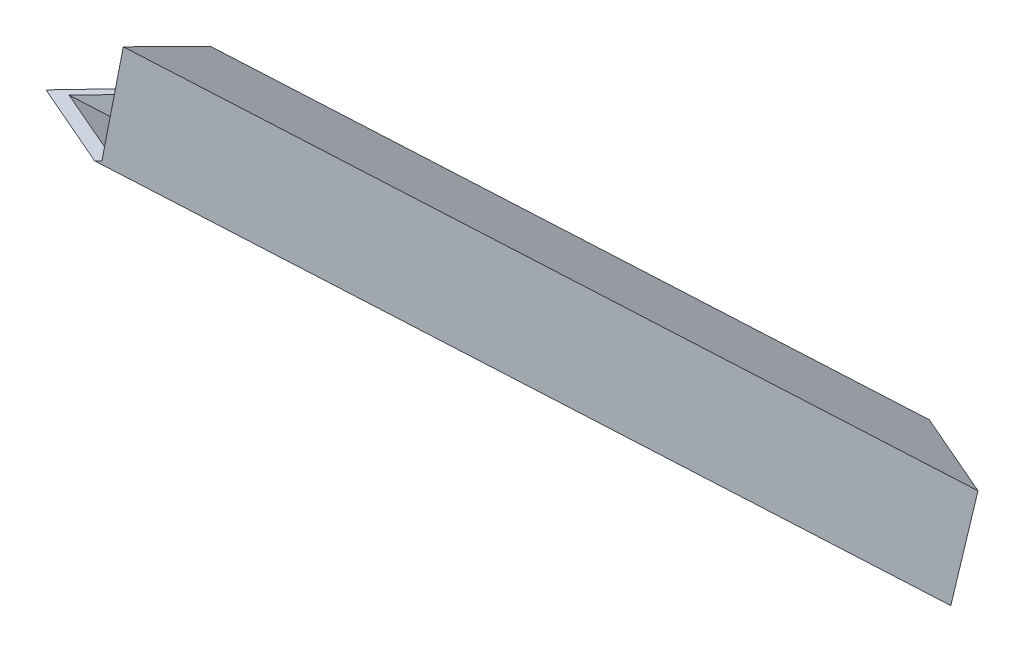
ISO-10303-21;
HEADER;
FILE_DESCRIPTION(('STEP AP214'),'2;1');
FILE_NAME('part.step','',(''),(''),'','','');
FILE_SCHEMA(('AUTOMOTIVE_DESIGN { 1 0 10303 214 1 1 1 1 }'));
ENDSEC;
DATA;
#1=APPLICATION_CONTEXT('core data for automotive mechanical design processes');
#2=APPLICATION_PROTOCOL_DEFINITION('international standard','automotive_design',2000,#1);
#3=PRODUCT_CONTEXT('',#1,'mechanical');
#4=PRODUCT('Part','Part','',(#3));
#5=PRODUCT_RELATED_PRODUCT_CATEGORY('part','',(#4));
#6=PRODUCT_DEFINITION_FORMATION('','',#4);
#7=PRODUCT_DEFINITION_CONTEXT('part definition',#1,'design');
#8=PRODUCT_DEFINITION('design','',#6,#7);
#9=PRODUCT_DEFINITION_SHAPE('','',#8);
#10=(LENGTH_UNIT() NAMED_UNIT(*) SI_UNIT(.MILLI.,.METRE.));
#11=(NAMED_UNIT(*) PLANE_ANGLE_UNIT() SI_UNIT($,.RADIAN.));
#12=(NAMED_UNIT(*) SI_UNIT($,.STERADIAN.) SOLID_ANGLE_UNIT());
#13=UNCERTAINTY_MEASURE_WITH_UNIT(LENGTH_MEASURE(1.E-05),#10,'distance_accuracy_value','');
#14=(GEOMETRIC_REPRESENTATION_CONTEXT(3) GLOBAL_UNCERTAINTY_ASSIGNED_CONTEXT((#13)) GLOBAL_UNIT_ASSIGNED_CONTEXT((#10,
#11,#12)) REPRESENTATION_CONTEXT('',''));
#15=CARTESIAN_POINT('',(0.,0.,0.));
#16=DIRECTION('',(0.,0.,1.));
#17=DIRECTION('',(1.,0.,0.));
#18=AXIS2_PLACEMENT_3D('',#15,#16,#17);
#19=CARTESIAN_POINT('',(-240.064673273436,-10.,-1701.13546591161));
#20=DIRECTION('',(-0.993532672656404,0.,0.113546591160732));
#21=DIRECTION('',(0.113546591160732,0.,0.993532672656404));
#22=AXIS2_PLACEMENT_3D('',#19,#20,#21);
#23=PLANE('',#22);
#24=DIRECTION('',(-0.0310586126136645,0.961862937380512,-0.271762860369564));
#25=VECTOR('',#24,1.);
#26=CARTESIAN_POINT('',(-158.679335720857,-7.72550361489224,-989.013762326542));
#27=LINE('',#26,#25);
#28=CARTESIAN_POINT('',(-158.605892094566,-10.,-988.371130596495));
#29=VERTEX_POINT('',#28);
#30=CARTESIAN_POINT('',(-159.247416918517,9.8675632824665,-993.984472806062));
#31=VERTEX_POINT('',#30);
#32=EDGE_CURVE('E139',#29,#31,#27,.T.);
#33=ORIENTED_EDGE('',*,*,#32,.T.);
#34=DIRECTION('',(-0.099495133200515,-0.481857838250816,-0.870582415504507));
#35=VECTOR('',#34,1.);
#36=CARTESIAN_POINT('',(-159.154464581572,10.3177341672098,-993.171139857796));
#37=LINE('',#36,#35);
#38=CARTESIAN_POINT('',(-161.870514932966,-2.83617707250504,-1016.9365804325));
#39=VERTEX_POINT('',#38);
#40=EDGE_CURVE('E141',#31,#39,#37,.T.);
#41=ORIENTED_EDGE('',*,*,#40,.T.);
#42=DIRECTION('',(0.0310586126136645,-0.961862937380512,0.271762860369564));
#43=VECTOR('',#42,1.);
#44=CARTESIAN_POINT('',(-161.48568752584,-14.7540056248329,-1013.56934062014));
#45=LINE('',#44,#43);
#46=CARTESIAN_POINT('',(-161.639194655938,-10.,-1014.9125280085));
#47=VERTEX_POINT('',#46);
#48=EDGE_CURVE('E180',#39,#47,#45,.T.);
#49=ORIENTED_EDGE('',*,*,#48,.T.);
#50=DIRECTION('',(0.113546591160732,0.,0.993532672656404));
#51=VECTOR('',#50,1.);
#52=CARTESIAN_POINT('',(-240.064673273436,-10.,-1701.13546591161));
#53=LINE('',#52,#51);
#54=CARTESIAN_POINT('',(-161.396530451028,-10.,-1012.78921621554));
#55=VERTEX_POINT('',#54);
#56=EDGE_CURVE('E176',#47,#55,#53,.T.);
#57=ORIENTED_EDGE('',*,*,#56,.T.);
#58=DIRECTION('',(0.0310586126136645,-0.961862937380512,0.271762860369564));
#59=VECTOR('',#58,1.);
#60=CARTESIAN_POINT('',(-161.307849638088,-12.7463811176913,-1012.01325910231));
#61=LINE('',#60,#59);
#62=CARTESIAN_POINT('',(-161.607753909707,-3.45856111039706,-1014.63742147898));
#63=VERTEX_POINT('',#62);
#64=EDGE_CURVE('E174',#63,#55,#61,.T.);
#65=ORIENTED_EDGE('',*,*,#64,.F.);
#66=DIRECTION('',(-0.099495133200515,-0.481857838250816,-0.870582415504507));
#67=VECTOR('',#66,1.);
#68=CARTESIAN_POINT('',(-159.184380698872,8.27790618287634,-993.432905884172));
#69=LINE('',#68,#67);
#70=CARTESIAN_POINT('',(-159.404351577569,7.2125807877791,-995.357651072772));
#71=VERTEX_POINT('',#70);
#72=EDGE_CURVE('E150',#71,#63,#69,.T.);
#73=ORIENTED_EDGE('',*,*,#72,.F.);
#74=DIRECTION('',(-0.0310586126136645,0.961862937380512,-0.271762860369564));
#75=VECTOR('',#74,1.);
#76=CARTESIAN_POINT('',(-158.950514121903,-6.84243942934128,-991.386573335689));
#77=LINE('',#76,#75);
#78=CARTESIAN_POINT('',(-158.848763165483,-9.99359350826317,-990.496252467016));
#79=VERTEX_POINT('',#78);
#80=EDGE_CURVE('E159',#79,#71,#77,.T.);
#81=ORIENTED_EDGE('',*,*,#80,.F.);
#82=DIRECTION('',(0.0994951332005149,0.481857838250817,0.870582415504506));
#83=VECTOR('',#82,1.);
#84=CARTESIAN_POINT('',(-158.230473125595,-6.99919677297728,-985.086214617996));
#85=LINE('',#84,#83);
#86=CARTESIAN_POINT('',(-158.850085992877,-10.,-990.507827206718));
#87=VERTEX_POINT('',#86);
#88=EDGE_CURVE('E138',#87,#79,#85,.T.);
#89=ORIENTED_EDGE('',*,*,#88,.F.);
#90=EDGE_CURVE('E169',#87,#29,#53,.T.);
#91=ORIENTED_EDGE('',*,*,#90,.T.);
#92=EDGE_LOOP('',(#33,#41,#49,#57,#65,#73,#81,#89,#91));
#93=FACE_BOUND('',#92,.T.);
#94=ADVANCED_FACE('F41',(#93),#23,.T.);
#95=CARTESIAN_POINT('',(-178.645390112232,-10.5725607534596,-996.808649348804));
#96=DIRECTION('',(0.708778209555371,0.212903658810695,0.672536602516548));
#97=DIRECTION('',(0.688317522845566,0.,-0.725409531053835));
#98=AXIS2_PLACEMENT_3D('',#95,#96,#97);
#99=PLANE('',#98);
#100=DIRECTION('',(0.,0.953369256848501,-0.301806328787413));
#101=VECTOR('',#100,1.);
#102=CARTESIAN_POINT('',(-69.9999999999999,-43.5179938494138,-1100.87924055687));
#103=LINE('',#102,#101);
#104=CARTESIAN_POINT('',(-69.9999999999999,-89.9999999999999,-1086.16451850116));
#105=VERTEX_POINT('',#104);
#106=CARTESIAN_POINT('',(-70.,-69.9999999999999,-1092.49588122593));
#107=VERTEX_POINT('',#106);
#108=EDGE_CURVE('E201',#105,#107,#103,.T.);
#109=ORIENTED_EDGE('',*,*,#108,.F.);
#110=DIRECTION('',(0.672536602516548,-0.491671667636119,-0.553130626090634));
#111=VECTOR('',#110,1.);
#112=CARTESIAN_POINT('',(-178.645390112232,-10.5725607534596,-996.808649348804));
#113=LINE('',#112,#111);
#114=CARTESIAN_POINT('',(-179.428571428571,-10.,-996.164518501162));
#115=VERTEX_POINT('',#114);
#116=EDGE_CURVE('E56',#115,#105,#113,.T.);
#117=ORIENTED_EDGE('',*,*,#116,.F.);
#118=DIRECTION('',(-0.688317522845566,0.,0.725409531053835));
#119=VECTOR('',#118,1.);
#120=CARTESIAN_POINT('',(-178.735892671024,-10.,-996.894524284839));
#121=LINE('',#120,#119);
#122=EDGE_CURVE('E168',#47,#115,#121,.T.);
#123=ORIENTED_EDGE('',*,*,#122,.F.);
#124=ORIENTED_EDGE('',*,*,#48,.F.);
#125=DIRECTION('',(0.672536602516548,-0.491671667636119,-0.553130626090634));
#126=VECTOR('',#125,1.);
#127=CARTESIAN_POINT('',(-174.387316936018,6.31448757724575,-1006.64208270153));
#128=LINE('',#127,#126);
#129=EDGE_CURVE('E158',#39,#107,#128,.T.);
#130=ORIENTED_EDGE('',*,*,#129,.T.);
#131=EDGE_LOOP('',(#109,#117,#123,#124,#130));
#132=FACE_BOUND('',#131,.T.);
#133=ADVANCED_FACE('F218',(#132),#99,.F.);
#134=CARTESIAN_POINT('',(-160.211752744911,10.5725607534596,-993.191350651195));
#135=DIRECTION('',(-0.212903658810694,-0.844352416535263,0.491671667636119));
#136=DIRECTION('',(0.,-0.503208632889708,-0.864164956351084));
#137=AXIS2_PLACEMENT_3D('',#134,#135,#136);
#138=PLANE('',#137);
#139=DIRECTION('',(0.917660497954147,0.,0.397365336302184));
#140=VECTOR('',#139,1.);
#141=CARTESIAN_POINT('',(-109.756341443655,-69.9999999999998,-1109.71117165536));
#142=LINE('',#141,#140);
#143=CARTESIAN_POINT('',(-50.0000000000001,-69.9999999999998,-1083.83548149884));
#144=VERTEX_POINT('',#143);
#145=EDGE_CURVE('E195',#107,#144,#142,.T.);
#146=ORIENTED_EDGE('',*,*,#145,.F.);
#147=ORIENTED_EDGE('',*,*,#129,.F.);
#148=ORIENTED_EDGE('',*,*,#40,.F.);
#149=DIRECTION('',(0.672536602516548,-0.491671667636119,-0.553130626090634));
#150=VECTOR('',#149,1.);
#151=CARTESIAN_POINT('',(-160.211752744911,10.5725607534596,-993.191350651195));
#152=LINE('',#151,#150);
#153=EDGE_CURVE('E155',#31,#144,#152,.T.);
#154=ORIENTED_EDGE('',*,*,#153,.T.);
#155=EDGE_LOOP('',(#146,#147,#148,#154));
#156=FACE_BOUND('',#155,.T.);
#157=ADVANCED_FACE('F209',(#156),#138,.F.);
#158=CARTESIAN_POINT('',(-164.469825921125,-6.31448757724561,-983.357917298473));
#159=DIRECTION('',(-0.708778209555371,-0.212903658810695,-0.672536602516548));
#160=DIRECTION('',(-0.688317522845566,0.,0.725409531053835));
#161=AXIS2_PLACEMENT_3D('',#158,#159,#160);
#162=PLANE('',#161);
#163=DIRECTION('',(0.,-0.953369256848501,0.301806328787413));
#164=VECTOR('',#163,1.);
#165=CARTESIAN_POINT('',(-49.9999999999999,-41.0261121339266,-1093.00769118018));
#166=LINE('',#165,#164);
#167=CARTESIAN_POINT('',(-49.9999999999999,-89.9999999999999,-1077.50411877407));
#168=VERTEX_POINT('',#167);
#169=EDGE_CURVE('E191',#144,#168,#166,.T.);
#170=ORIENTED_EDGE('',*,*,#169,.F.);
#171=ORIENTED_EDGE('',*,*,#153,.F.);
#172=ORIENTED_EDGE('',*,*,#32,.F.);
#173=DIRECTION('',(0.688317522845566,0.,-0.725409531053835));
#174=VECTOR('',#173,1.);
#175=CARTESIAN_POINT('',(-163.887270615505,-10.,-982.805149506323));
#176=LINE('',#175,#174);
#177=CARTESIAN_POINT('',(-159.428571428571,-10.,-987.504118774071));
#178=VERTEX_POINT('',#177);
#179=EDGE_CURVE('E166',#178,#29,#176,.T.);
#180=ORIENTED_EDGE('',*,*,#179,.F.);
#181=DIRECTION('',(0.672536602516548,-0.491671667636119,-0.553130626090634));
#182=VECTOR('',#181,1.);
#183=CARTESIAN_POINT('',(-164.469825921125,-6.31448757724561,-983.357917298473));
#184=LINE('',#183,#182);
#185=EDGE_CURVE('E152',#178,#168,#184,.T.);
#186=ORIENTED_EDGE('',*,*,#185,.T.);
#187=EDGE_LOOP('',(#170,#171,#172,#180,#186));
#188=FACE_BOUND('',#187,.T.);
#189=ADVANCED_FACE('F213',(#188),#162,.F.);
#190=CARTESIAN_POINT('',(-164.469825921125,-6.31448757724561,-983.357917298473));
#191=DIRECTION('',(0.212903658810694,0.844352416535263,-0.491671667636119));
#192=DIRECTION('',(0.,0.503208632889708,0.864164956351084));
#193=AXIS2_PLACEMENT_3D('',#190,#191,#192);
#194=PLANE('',#193);
#195=DIRECTION('',(-0.917660497954147,0.,-0.397365336302184));
#196=VECTOR('',#195,1.);
#197=CARTESIAN_POINT('',(-112.065050526604,-89.9999999999999,-1104.37952610619));
#198=LINE('',#197,#196);
#199=EDGE_CURVE('E187',#168,#105,#198,.T.);
#200=ORIENTED_EDGE('',*,*,#199,.F.);
#201=ORIENTED_EDGE('',*,*,#185,.F.);
#202=DIRECTION('',(0.917660497954147,0.,0.397365336302183));
#203=VECTOR('',#202,1.);
#204=CARTESIAN_POINT('',(-162.161918074991,-10.,-988.687712501606));
#205=LINE('',#204,#203);
#206=EDGE_CURVE('E49',#115,#178,#205,.T.);
#207=ORIENTED_EDGE('',*,*,#206,.F.);
#208=ORIENTED_EDGE('',*,*,#116,.T.);
#209=EDGE_LOOP('',(#200,#201,#207,#208));
#210=FACE_BOUND('',#209,.T.);
#211=ADVANCED_FACE('F216',(#210),#194,.F.);
#212=CARTESIAN_POINT('',(-259.935326726564,-10.,-1698.86453408839));
#213=DIRECTION('',(0.,1.,0.));
#214=DIRECTION('',(0.,0.,1.));
#215=AXIS2_PLACEMENT_3D('',#212,#213,#214);
#216=PLANE('',#215);
#217=ORIENTED_EDGE('',*,*,#179,.T.);
#218=ORIENTED_EDGE('',*,*,#90,.F.);
#219=DIRECTION('',(0.917660497954148,0.,0.397365336302181));
#220=VECTOR('',#219,1.);
#221=CARTESIAN_POINT('',(-162.322645260596,-10.,-992.011514773441));
#222=LINE('',#221,#220);
#223=CARTESIAN_POINT('',(-175.64,-9.99999999999999,-997.778195540976));
#224=VERTEX_POINT('',#223);
#225=EDGE_CURVE('E143',#224,#87,#222,.T.);
#226=ORIENTED_EDGE('',*,*,#225,.F.);
#227=DIRECTION('',(-0.688317522845566,0.,0.725409531053835));
#228=VECTOR('',#227,1.);
#229=CARTESIAN_POINT('',(-176.993815195118,-10.,-996.351426044008));
#230=LINE('',#229,#228);
#231=EDGE_CURVE('E151',#55,#224,#230,.T.);
#232=ORIENTED_EDGE('',*,*,#231,.F.);
#233=ORIENTED_EDGE('',*,*,#56,.F.);
#234=ORIENTED_EDGE('',*,*,#122,.T.);
#235=ORIENTED_EDGE('',*,*,#206,.T.);
#236=EDGE_LOOP('',(#217,#218,#226,#232,#233,#234,#235));
#237=FACE_BOUND('',#236,.T.);
#238=ADVANCED_FACE('F200',(#237),#216,.T.);
#239=CARTESIAN_POINT('',(-165.263225202316,-5.30416956488632,-985.220650530717));
#240=DIRECTION('',(0.212903658810693,0.844352416535262,-0.49167166763612));
#241=DIRECTION('',(0.,0.503208632889709,0.864164956351083));
#242=AXIS2_PLACEMENT_3D('',#239,#240,#241);
#243=PLANE('',#242);
#244=DIRECTION('',(0.672536602516548,-0.491671667636119,-0.553130626090634));
#245=VECTOR('',#244,1.);
#246=CARTESIAN_POINT('',(-165.263225202316,-5.30416956488632,-985.220650530717));
#247=LINE('',#246,#245);
#248=CARTESIAN_POINT('',(-51.5999999999999,-88.3999999999999,-1078.70345977022));
#249=VERTEX_POINT('',#248);
#250=EDGE_CURVE('E128',#79,#249,#247,.T.);
#251=ORIENTED_EDGE('',*,*,#250,.T.);
#252=DIRECTION('',(-0.917660497954147,0.,-0.397365336302183));
#253=VECTOR('',#252,1.);
#254=CARTESIAN_POINT('',(-113.227715063176,-88.4,-1105.38949210594));
#255=LINE('',#254,#253);
#256=CARTESIAN_POINT('',(-68.4,-88.3999999999999,-1085.97819554098));
#257=VERTEX_POINT('',#256);
#258=EDGE_CURVE('E11',#249,#257,#255,.T.);
#259=ORIENTED_EDGE('',*,*,#258,.T.);
#260=DIRECTION('',(0.672536602516548,-0.491671667636119,-0.553130626090634));
#261=VECTOR('',#260,1.);
#262=CARTESIAN_POINT('',(-177.170699122846,-8.88095103290597,-996.519265452995));
#263=LINE('',#262,#261);
#264=EDGE_CURVE('E148',#224,#257,#263,.T.);
#265=ORIENTED_EDGE('',*,*,#264,.F.);
#266=ORIENTED_EDGE('',*,*,#225,.T.);
#267=ORIENTED_EDGE('',*,*,#88,.T.);
#268=EDGE_LOOP('',(#251,#259,#265,#266,#267));
#269=FACE_BOUND('',#268,.T.);
#270=ADVANCED_FACE('F135',(#269),#243,.T.);
#271=CARTESIAN_POINT('',(-165.263225202316,-5.30416956488632,-985.220650530717));
#272=DIRECTION('',(-0.708778209555371,-0.212903658810695,-0.672536602516548));
#273=DIRECTION('',(-0.688317522845566,0.,0.725409531053835));
#274=AXIS2_PLACEMENT_3D('',#271,#272,#273);
#275=PLANE('',#274);
#276=DIRECTION('',(0.672536602516548,-0.491671667636119,-0.553130626090634));
#277=VECTOR('',#276,1.);
#278=CARTESIAN_POINT('',(-161.686443734296,8.88095103290611,-993.480734547004));
#279=LINE('',#278,#277);
#280=CARTESIAN_POINT('',(-51.6,-71.5999999999999,-1084.02180445902));
#281=VERTEX_POINT('',#280);
#282=EDGE_CURVE('E130',#71,#281,#279,.T.);
#283=ORIENTED_EDGE('',*,*,#282,.T.);
#284=DIRECTION('',(0.,-0.953369256848501,0.301806328787413));
#285=VECTOR('',#284,1.);
#286=CARTESIAN_POINT('',(-51.5999999999999,-39.7712019673194,-1094.09778773093));
#287=LINE('',#286,#285);
#288=EDGE_CURVE('E119',#281,#249,#287,.T.);
#289=ORIENTED_EDGE('',*,*,#288,.T.);
#290=ORIENTED_EDGE('',*,*,#250,.F.);
#291=ORIENTED_EDGE('',*,*,#80,.T.);
#292=EDGE_LOOP('',(#283,#289,#290,#291));
#293=FACE_BOUND('',#292,.T.);
#294=ADVANCED_FACE('F126',(#293),#275,.T.);
#295=CARTESIAN_POINT('',(-161.686443734296,8.88095103290611,-993.480734547004));
#296=DIRECTION('',(-0.212903658810694,-0.844352416535263,0.491671667636119));
#297=DIRECTION('',(0.,-0.503208632889708,-0.864164956351084));
#298=AXIS2_PLACEMENT_3D('',#295,#296,#297);
#299=PLANE('',#298);
#300=DIRECTION('',(0.672536602516548,-0.491671667636119,-0.553130626090634));
#301=VECTOR('',#300,1.);
#302=CARTESIAN_POINT('',(-173.593917654827,5.30416956488645,-1004.77934946928));
#303=LINE('',#302,#301);
#304=CARTESIAN_POINT('',(-68.3999999999999,-71.5999999999999,-1091.29654022978));
#305=VERTEX_POINT('',#304);
#306=EDGE_CURVE('E160',#63,#305,#303,.T.);
#307=ORIENTED_EDGE('',*,*,#306,.T.);
#308=DIRECTION('',(0.917660497954147,0.,0.397365336302184));
#309=VECTOR('',#308,1.);
#310=CARTESIAN_POINT('',(-111.288399433499,-71.5999999999999,-1109.86807436724));
#311=LINE('',#310,#309);
#312=EDGE_CURVE('E132',#305,#281,#311,.T.);
#313=ORIENTED_EDGE('',*,*,#312,.T.);
#314=ORIENTED_EDGE('',*,*,#282,.F.);
#315=ORIENTED_EDGE('',*,*,#72,.T.);
#316=EDGE_LOOP('',(#307,#313,#314,#315));
#317=FACE_BOUND('',#316,.T.);
#318=ADVANCED_FACE('F237',(#317),#299,.T.);
#319=CARTESIAN_POINT('',(-177.170699122846,-8.88095103290597,-996.519265452995));
#320=DIRECTION('',(0.708778209555371,0.212903658810695,0.672536602516548));
#321=DIRECTION('',(0.688317522845566,0.,-0.725409531053835));
#322=AXIS2_PLACEMENT_3D('',#319,#320,#321);
#323=PLANE('',#322);
#324=ORIENTED_EDGE('',*,*,#264,.T.);
#325=DIRECTION('',(0.,0.953369256848501,-0.301806328787413));
#326=VECTOR('',#325,1.);
#327=CARTESIAN_POINT('',(-68.3999999999999,-41.8643826083286,-1100.70988920735));
#328=LINE('',#327,#326);
#329=EDGE_CURVE('E64',#257,#305,#328,.T.);
#330=ORIENTED_EDGE('',*,*,#329,.T.);
#331=ORIENTED_EDGE('',*,*,#306,.F.);
#332=ORIENTED_EDGE('',*,*,#64,.T.);
#333=ORIENTED_EDGE('',*,*,#231,.T.);
#334=EDGE_LOOP('',(#324,#330,#331,#332,#333));
#335=FACE_BOUND('',#334,.T.);
#336=ADVANCED_FACE('F43',(#335),#323,.T.);
#337=CARTESIAN_POINT('',(-60.,-79.9999999999999,-1085.));
#338=DIRECTION('',(0.38158995692014,-0.278969159106107,-0.881229432693505));
#339=DIRECTION('',(-0.917660497954147,0.,-0.397365336302184));
#340=AXIS2_PLACEMENT_3D('',#337,#338,#339);
#341=PLANE('',#340);
#342=ORIENTED_EDGE('',*,*,#329,.F.);
#343=ORIENTED_EDGE('',*,*,#258,.F.);
#344=ORIENTED_EDGE('',*,*,#288,.F.);
#345=ORIENTED_EDGE('',*,*,#312,.F.);
#346=EDGE_LOOP('',(#342,#343,#344,#345));
#347=FACE_BOUND('',#346,.T.);
#348=ORIENTED_EDGE('',*,*,#169,.T.);
#349=ORIENTED_EDGE('',*,*,#199,.T.);
#350=ORIENTED_EDGE('',*,*,#108,.T.);
#351=ORIENTED_EDGE('',*,*,#145,.T.);
#352=EDGE_LOOP('',(#348,#349,#350,#351));
#353=FACE_BOUND('',#352,.T.);
#354=ADVANCED_FACE('F117',(#347,#353),#341,.T.);
#355=CLOSED_SHELL('',(#94,#133,#157,#189,#211,#238,#270,#294,#318,#336,#354));
#356=MANIFOLD_SOLID_BREP('B2',#355);
#357=ADVANCED_BREP_SHAPE_REPRESENTATION('',(#18,#356),#14);
#358=SHAPE_DEFINITION_REPRESENTATION(#9,#357);
ENDSEC;
END-ISO-10303-21;
